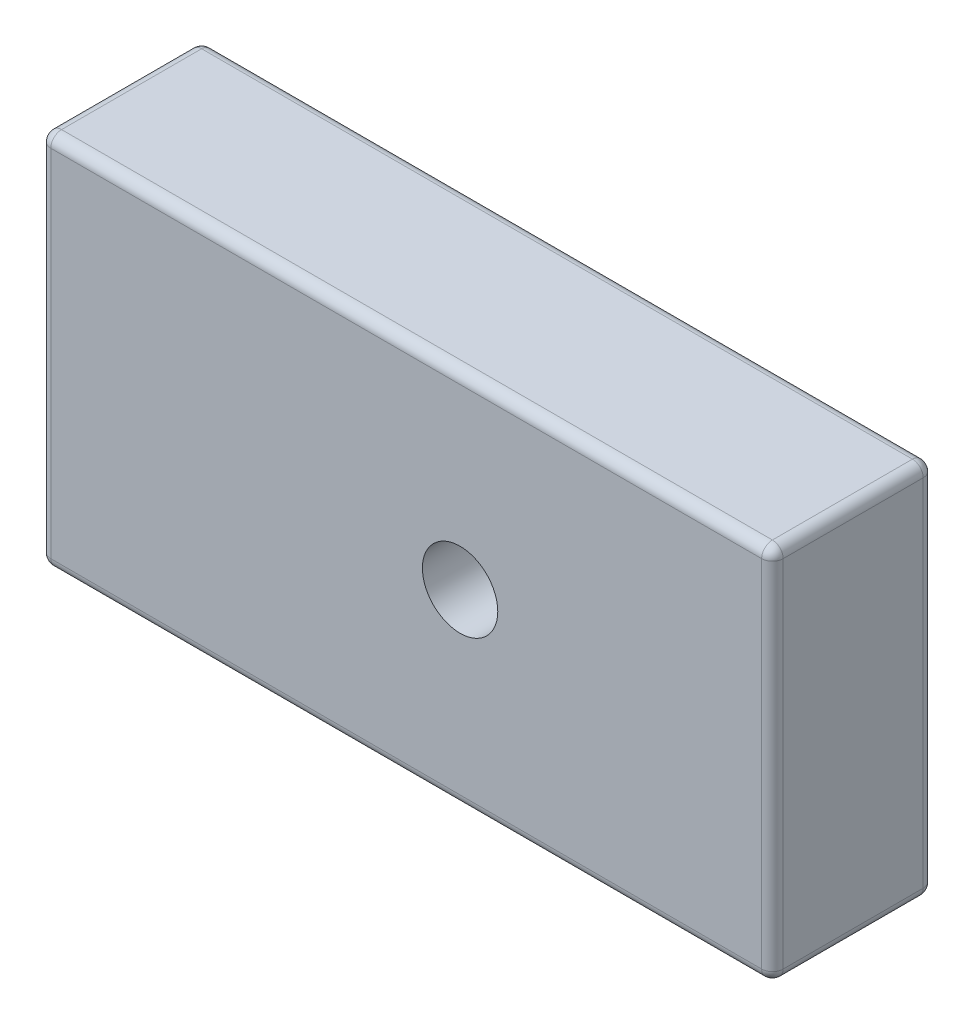
ISO-10303-21;
HEADER;
FILE_DESCRIPTION(('STEP AP214'),'2;1');
FILE_NAME('part.step','',(''),(''),'','','');
FILE_SCHEMA(('AUTOMOTIVE_DESIGN { 1 0 10303 214 1 1 1 1 }'));
ENDSEC;
DATA;
#1=APPLICATION_CONTEXT('core data for automotive mechanical design processes');
#2=APPLICATION_PROTOCOL_DEFINITION('international standard','automotive_design',2000,#1);
#3=PRODUCT_CONTEXT('',#1,'mechanical');
#4=PRODUCT('Part','Part','',(#3));
#5=PRODUCT_RELATED_PRODUCT_CATEGORY('part','',(#4));
#6=PRODUCT_DEFINITION_FORMATION('','',#4);
#7=PRODUCT_DEFINITION_CONTEXT('part definition',#1,'design');
#8=PRODUCT_DEFINITION('design','',#6,#7);
#9=PRODUCT_DEFINITION_SHAPE('','',#8);
#10=(LENGTH_UNIT() NAMED_UNIT(*) SI_UNIT(.MILLI.,.METRE.));
#11=(NAMED_UNIT(*) PLANE_ANGLE_UNIT() SI_UNIT($,.RADIAN.));
#12=(NAMED_UNIT(*) SI_UNIT($,.STERADIAN.) SOLID_ANGLE_UNIT());
#13=UNCERTAINTY_MEASURE_WITH_UNIT(LENGTH_MEASURE(1.E-05),#10,'distance_accuracy_value','');
#14=(GEOMETRIC_REPRESENTATION_CONTEXT(3) GLOBAL_UNCERTAINTY_ASSIGNED_CONTEXT((#13)) GLOBAL_UNIT_ASSIGNED_CONTEXT((#10,
#11,#12)) REPRESENTATION_CONTEXT('',''));
#15=CARTESIAN_POINT('',(0.,0.,0.));
#16=DIRECTION('',(0.,0.,1.));
#17=DIRECTION('',(1.,0.,0.));
#18=AXIS2_PLACEMENT_3D('',#15,#16,#17);
#19=CARTESIAN_POINT('',(34.,-17.5,15.));
#20=DIRECTION('',(-1.,0.,0.));
#21=DIRECTION('',(0.,0.,1.));
#22=AXIS2_PLACEMENT_3D('',#19,#20,#21);
#23=PLANE('',#22);
#24=DIRECTION('',(0.,1.,0.));
#25=VECTOR('',#24,1.);
#26=CARTESIAN_POINT('',(34.,17.5,1.));
#27=LINE('',#26,#25);
#28=CARTESIAN_POINT('',(34.,-16.5,1.));
#29=VERTEX_POINT('',#28);
#30=CARTESIAN_POINT('',(34.,16.5,1.));
#31=VERTEX_POINT('',#30);
#32=EDGE_CURVE('E348',#29,#31,#27,.T.);
#33=ORIENTED_EDGE('',*,*,#32,.T.);
#34=DIRECTION('',(0.,0.,-1.));
#35=VECTOR('',#34,1.);
#36=CARTESIAN_POINT('',(34.,16.5,15.));
#37=LINE('',#36,#35);
#38=CARTESIAN_POINT('',(34.,16.5,14.));
#39=VERTEX_POINT('',#38);
#40=EDGE_CURVE('E199',#31,#39,#37,.F.);
#41=ORIENTED_EDGE('',*,*,#40,.T.);
#42=DIRECTION('',(0.,1.,0.));
#43=VECTOR('',#42,1.);
#44=CARTESIAN_POINT('',(34.,-17.5,14.));
#45=LINE('',#44,#43);
#46=CARTESIAN_POINT('',(34.,-16.5,14.));
#47=VERTEX_POINT('',#46);
#48=EDGE_CURVE('E350',#39,#47,#45,.F.);
#49=ORIENTED_EDGE('',*,*,#48,.T.);
#50=DIRECTION('',(0.,0.,-1.));
#51=VECTOR('',#50,1.);
#52=CARTESIAN_POINT('',(34.,-16.5,15.));
#53=LINE('',#52,#51);
#54=EDGE_CURVE('E329',#47,#29,#53,.T.);
#55=ORIENTED_EDGE('',*,*,#54,.T.);
#56=EDGE_LOOP('',(#33,#41,#49,#55));
#57=FACE_BOUND('',#56,.T.);
#58=ADVANCED_FACE('F39',(#57),#23,.F.);
#59=CARTESIAN_POINT('',(-34.,17.5,15.));
#60=DIRECTION('',(0.,-1.,0.));
#61=DIRECTION('',(0.,0.,-1.));
#62=AXIS2_PLACEMENT_3D('',#59,#60,#61);
#63=PLANE('',#62);
#64=DIRECTION('',(0.,0.,-1.));
#65=VECTOR('',#64,1.);
#66=CARTESIAN_POINT('',(-33.,17.5,15.));
#67=LINE('',#66,#65);
#68=CARTESIAN_POINT('',(-33.,17.5,1.));
#69=VERTEX_POINT('',#68);
#70=CARTESIAN_POINT('',(-33.,17.5,14.));
#71=VERTEX_POINT('',#70);
#72=EDGE_CURVE('E188',#69,#71,#67,.F.);
#73=ORIENTED_EDGE('',*,*,#72,.T.);
#74=DIRECTION('',(-1.,0.,0.));
#75=VECTOR('',#74,1.);
#76=CARTESIAN_POINT('',(-34.,17.5,14.));
#77=LINE('',#76,#75);
#78=CARTESIAN_POINT('',(33.,17.5,14.));
#79=VERTEX_POINT('',#78);
#80=EDGE_CURVE('E194',#71,#79,#77,.F.);
#81=ORIENTED_EDGE('',*,*,#80,.T.);
#82=DIRECTION('',(0.,0.,-1.));
#83=VECTOR('',#82,1.);
#84=CARTESIAN_POINT('',(33.,17.5,15.));
#85=LINE('',#84,#83);
#86=CARTESIAN_POINT('',(33.,17.5,1.));
#87=VERTEX_POINT('',#86);
#88=EDGE_CURVE('E192',#79,#87,#85,.T.);
#89=ORIENTED_EDGE('',*,*,#88,.T.);
#90=DIRECTION('',(-1.,0.,0.));
#91=VECTOR('',#90,1.);
#92=CARTESIAN_POINT('',(-33.,17.5,1.));
#93=LINE('',#92,#91);
#94=EDGE_CURVE('E190',#87,#69,#93,.T.);
#95=ORIENTED_EDGE('',*,*,#94,.T.);
#96=EDGE_LOOP('',(#73,#81,#89,#95));
#97=FACE_BOUND('',#96,.T.);
#98=ADVANCED_FACE('F239',(#97),#63,.F.);
#99=CARTESIAN_POINT('',(-34.,-17.5,15.));
#100=DIRECTION('',(1.,0.,0.));
#101=DIRECTION('',(0.,0.,-1.));
#102=AXIS2_PLACEMENT_3D('',#99,#100,#101);
#103=PLANE('',#102);
#104=DIRECTION('',(0.,-1.,0.));
#105=VECTOR('',#104,1.);
#106=CARTESIAN_POINT('',(-34.,-17.5,14.));
#107=LINE('',#106,#105);
#108=CARTESIAN_POINT('',(-34.,-16.5,14.));
#109=VERTEX_POINT('',#108);
#110=CARTESIAN_POINT('',(-34.,16.5,14.));
#111=VERTEX_POINT('',#110);
#112=EDGE_CURVE('E130',#109,#111,#107,.F.);
#113=ORIENTED_EDGE('',*,*,#112,.T.);
#114=DIRECTION('',(0.,0.,-1.));
#115=VECTOR('',#114,1.);
#116=CARTESIAN_POINT('',(-34.,16.5,15.));
#117=LINE('',#116,#115);
#118=CARTESIAN_POINT('',(-34.,16.5,1.));
#119=VERTEX_POINT('',#118);
#120=EDGE_CURVE('E11',#111,#119,#117,.T.);
#121=ORIENTED_EDGE('',*,*,#120,.T.);
#122=DIRECTION('',(0.,-1.,0.));
#123=VECTOR('',#122,1.);
#124=CARTESIAN_POINT('',(-34.,-17.5,1.));
#125=LINE('',#124,#123);
#126=CARTESIAN_POINT('',(-34.,-16.5,1.));
#127=VERTEX_POINT('',#126);
#128=EDGE_CURVE('E131',#119,#127,#125,.T.);
#129=ORIENTED_EDGE('',*,*,#128,.T.);
#130=DIRECTION('',(0.,0.,-1.));
#131=VECTOR('',#130,1.);
#132=CARTESIAN_POINT('',(-34.,-16.5,15.));
#133=LINE('',#132,#131);
#134=EDGE_CURVE('E127',#127,#109,#133,.F.);
#135=ORIENTED_EDGE('',*,*,#134,.T.);
#136=EDGE_LOOP('',(#113,#121,#129,#135));
#137=FACE_BOUND('',#136,.T.);
#138=ADVANCED_FACE('F129',(#137),#103,.F.);
#139=CARTESIAN_POINT('',(-34.,-17.5,15.));
#140=DIRECTION('',(0.,1.,0.));
#141=DIRECTION('',(0.,0.,1.));
#142=AXIS2_PLACEMENT_3D('',#139,#140,#141);
#143=PLANE('',#142);
#144=DIRECTION('',(0.,0.,-1.));
#145=VECTOR('',#144,1.);
#146=CARTESIAN_POINT('',(33.,-17.5,15.));
#147=LINE('',#146,#145);
#148=CARTESIAN_POINT('',(33.,-17.5,1.));
#149=VERTEX_POINT('',#148);
#150=CARTESIAN_POINT('',(33.,-17.5,14.));
#151=VERTEX_POINT('',#150);
#152=EDGE_CURVE('E338',#149,#151,#147,.F.);
#153=ORIENTED_EDGE('',*,*,#152,.T.);
#154=DIRECTION('',(1.,0.,0.));
#155=VECTOR('',#154,1.);
#156=CARTESIAN_POINT('',(-34.,-17.5,14.));
#157=LINE('',#156,#155);
#158=CARTESIAN_POINT('',(-33.,-17.5,14.));
#159=VERTEX_POINT('',#158);
#160=EDGE_CURVE('E336',#151,#159,#157,.F.);
#161=ORIENTED_EDGE('',*,*,#160,.T.);
#162=DIRECTION('',(0.,0.,-1.));
#163=VECTOR('',#162,1.);
#164=CARTESIAN_POINT('',(-33.,-17.5,15.));
#165=LINE('',#164,#163);
#166=CARTESIAN_POINT('',(-33.,-17.5,1.));
#167=VERTEX_POINT('',#166);
#168=EDGE_CURVE('E161',#159,#167,#165,.T.);
#169=ORIENTED_EDGE('',*,*,#168,.T.);
#170=DIRECTION('',(1.,0.,0.));
#171=VECTOR('',#170,1.);
#172=CARTESIAN_POINT('',(33.,-17.5,1.));
#173=LINE('',#172,#171);
#174=EDGE_CURVE('E340',#167,#149,#173,.T.);
#175=ORIENTED_EDGE('',*,*,#174,.T.);
#176=EDGE_LOOP('',(#153,#161,#169,#175));
#177=FACE_BOUND('',#176,.T.);
#178=ADVANCED_FACE('F369',(#177),#143,.F.);
#179=CARTESIAN_POINT('',(0.,0.,15.));
#180=DIRECTION('',(0.,0.,-1.));
#181=DIRECTION('',(-1.,0.,0.));
#182=AXIS2_PLACEMENT_3D('',#179,#180,#181);
#183=PLANE('',#182);
#184=CARTESIAN_POINT('',(4.99999999999998,0.,15.));
#185=DIRECTION('',(0.,0.,1.));
#186=DIRECTION('',(1.,0.,0.));
#187=AXIS2_PLACEMENT_3D('',#184,#185,#186);
#188=CIRCLE('',#187,3.5);
#189=CARTESIAN_POINT('',(8.49999999999998,0.,15.));
#190=VERTEX_POINT('',#189);
#191=EDGE_CURVE('E357',#190,#190,#188,.T.);
#192=ORIENTED_EDGE('',*,*,#191,.F.);
#193=EDGE_LOOP('',(#192));
#194=FACE_BOUND('',#193,.T.);
#195=DIRECTION('',(0.,1.,0.));
#196=VECTOR('',#195,1.);
#197=CARTESIAN_POINT('',(33.,0.,15.));
#198=LINE('',#197,#196);
#199=CARTESIAN_POINT('',(33.,-16.5,15.));
#200=VERTEX_POINT('',#199);
#201=CARTESIAN_POINT('',(33.,16.5,15.));
#202=VERTEX_POINT('',#201);
#203=EDGE_CURVE('E157',#200,#202,#198,.T.);
#204=ORIENTED_EDGE('',*,*,#203,.T.);
#205=DIRECTION('',(-1.,0.,0.));
#206=VECTOR('',#205,1.);
#207=CARTESIAN_POINT('',(0.,16.5,15.));
#208=LINE('',#207,#206);
#209=CARTESIAN_POINT('',(-33.,16.5,15.));
#210=VERTEX_POINT('',#209);
#211=EDGE_CURVE('E186',#202,#210,#208,.T.);
#212=ORIENTED_EDGE('',*,*,#211,.T.);
#213=DIRECTION('',(0.,-1.,0.));
#214=VECTOR('',#213,1.);
#215=CARTESIAN_POINT('',(-33.,0.,15.));
#216=LINE('',#215,#214);
#217=CARTESIAN_POINT('',(-33.,-16.5,15.));
#218=VERTEX_POINT('',#217);
#219=EDGE_CURVE('E352',#210,#218,#216,.T.);
#220=ORIENTED_EDGE('',*,*,#219,.T.);
#221=DIRECTION('',(1.,0.,0.));
#222=VECTOR('',#221,1.);
#223=CARTESIAN_POINT('',(0.,-16.5,15.));
#224=LINE('',#223,#222);
#225=EDGE_CURVE('E156',#218,#200,#224,.T.);
#226=ORIENTED_EDGE('',*,*,#225,.T.);
#227=EDGE_LOOP('',(#204,#212,#220,#226));
#228=FACE_BOUND('',#227,.T.);
#229=ADVANCED_FACE('F366',(#194,#228),#183,.F.);
#230=CARTESIAN_POINT('',(0.,0.,0.));
#231=DIRECTION('',(0.,0.,-1.));
#232=DIRECTION('',(-1.,0.,0.));
#233=AXIS2_PLACEMENT_3D('',#230,#231,#232);
#234=PLANE('',#233);
#235=DIRECTION('',(0.,-1.,0.));
#236=VECTOR('',#235,1.);
#237=CARTESIAN_POINT('',(-33.,17.5,0.));
#238=LINE('',#237,#236);
#239=CARTESIAN_POINT('',(-33.,-16.5,0.));
#240=VERTEX_POINT('',#239);
#241=CARTESIAN_POINT('',(-33.,16.5,0.));
#242=VERTEX_POINT('',#241);
#243=EDGE_CURVE('E354',#240,#242,#238,.F.);
#244=ORIENTED_EDGE('',*,*,#243,.T.);
#245=DIRECTION('',(-1.,0.,0.));
#246=VECTOR('',#245,1.);
#247=CARTESIAN_POINT('',(33.,16.5,0.));
#248=LINE('',#247,#246);
#249=CARTESIAN_POINT('',(33.,16.5,0.));
#250=VERTEX_POINT('',#249);
#251=EDGE_CURVE('E203',#242,#250,#248,.F.);
#252=ORIENTED_EDGE('',*,*,#251,.T.);
#253=DIRECTION('',(0.,1.,0.));
#254=VECTOR('',#253,1.);
#255=CARTESIAN_POINT('',(33.,-17.5,0.));
#256=LINE('',#255,#254);
#257=CARTESIAN_POINT('',(33.,-16.5,0.));
#258=VERTEX_POINT('',#257);
#259=EDGE_CURVE('E346',#250,#258,#256,.F.);
#260=ORIENTED_EDGE('',*,*,#259,.T.);
#261=DIRECTION('',(1.,0.,0.));
#262=VECTOR('',#261,1.);
#263=CARTESIAN_POINT('',(-33.,-16.5,0.));
#264=LINE('',#263,#262);
#265=EDGE_CURVE('E325',#258,#240,#264,.F.);
#266=ORIENTED_EDGE('',*,*,#265,.T.);
#267=EDGE_LOOP('',(#244,#252,#260,#266));
#268=FACE_BOUND('',#267,.T.);
#269=ADVANCED_FACE('F277',(#268),#234,.T.);
#270=CARTESIAN_POINT('',(-33.,-17.5,1.));
#271=DIRECTION('',(0.,1.,0.));
#272=DIRECTION('',(0.,0.,1.));
#273=AXIS2_PLACEMENT_3D('',#270,#271,#272);
#274=CYLINDRICAL_SURFACE('',#273,1.);
#275=ORIENTED_EDGE('',*,*,#128,.F.);
#276=CARTESIAN_POINT('',(-33.,16.5,1.));
#277=DIRECTION('',(0.,1.,0.));
#278=DIRECTION('',(0.,0.,1.));
#279=AXIS2_PLACEMENT_3D('',#276,#277,#278);
#280=CIRCLE('',#279,1.);
#281=EDGE_CURVE('E48',#119,#242,#280,.F.);
#282=ORIENTED_EDGE('',*,*,#281,.T.);
#283=ORIENTED_EDGE('',*,*,#243,.F.);
#284=CARTESIAN_POINT('',(-33.,-16.5,1.));
#285=DIRECTION('',(0.,1.,0.));
#286=DIRECTION('',(0.,0.,1.));
#287=AXIS2_PLACEMENT_3D('',#284,#285,#286);
#288=CIRCLE('',#287,1.);
#289=EDGE_CURVE('E137',#240,#127,#288,.T.);
#290=ORIENTED_EDGE('',*,*,#289,.T.);
#291=EDGE_LOOP('',(#275,#282,#283,#290));
#292=FACE_BOUND('',#291,.T.);
#293=ADVANCED_FACE('F274',(#292),#274,.T.);
#294=CARTESIAN_POINT('',(-33.,0.,14.));
#295=DIRECTION('',(0.,-1.,0.));
#296=DIRECTION('',(0.,0.,-1.));
#297=AXIS2_PLACEMENT_3D('',#294,#295,#296);
#298=CYLINDRICAL_SURFACE('',#297,1.);
#299=ORIENTED_EDGE('',*,*,#219,.F.);
#300=CARTESIAN_POINT('',(-33.,16.5,14.));
#301=DIRECTION('',(0.,-1.,0.));
#302=DIRECTION('',(0.,0.,-1.));
#303=AXIS2_PLACEMENT_3D('',#300,#301,#302);
#304=CIRCLE('',#303,1.);
#305=EDGE_CURVE('E136',#210,#111,#304,.T.);
#306=ORIENTED_EDGE('',*,*,#305,.T.);
#307=ORIENTED_EDGE('',*,*,#112,.F.);
#308=CARTESIAN_POINT('',(-33.,-16.5,14.));
#309=DIRECTION('',(0.,-1.,0.));
#310=DIRECTION('',(0.,0.,-1.));
#311=AXIS2_PLACEMENT_3D('',#308,#309,#310);
#312=CIRCLE('',#311,1.);
#313=EDGE_CURVE('E145',#109,#218,#312,.F.);
#314=ORIENTED_EDGE('',*,*,#313,.T.);
#315=EDGE_LOOP('',(#299,#306,#307,#314));
#316=FACE_BOUND('',#315,.T.);
#317=ADVANCED_FACE('F144',(#316),#298,.T.);
#318=CARTESIAN_POINT('',(33.,-17.5,1.));
#319=DIRECTION('',(0.,-1.,0.));
#320=DIRECTION('',(0.,0.,-1.));
#321=AXIS2_PLACEMENT_3D('',#318,#319,#320);
#322=CYLINDRICAL_SURFACE('',#321,1.);
#323=ORIENTED_EDGE('',*,*,#259,.F.);
#324=CARTESIAN_POINT('',(33.,16.5,1.));
#325=DIRECTION('',(0.,-1.,0.));
#326=DIRECTION('',(0.,0.,-1.));
#327=AXIS2_PLACEMENT_3D('',#324,#325,#326);
#328=CIRCLE('',#327,1.);
#329=EDGE_CURVE('E201',#250,#31,#328,.T.);
#330=ORIENTED_EDGE('',*,*,#329,.T.);
#331=ORIENTED_EDGE('',*,*,#32,.F.);
#332=CARTESIAN_POINT('',(33.,-16.5,1.));
#333=DIRECTION('',(0.,-1.,0.));
#334=DIRECTION('',(0.,0.,-1.));
#335=AXIS2_PLACEMENT_3D('',#332,#333,#334);
#336=CIRCLE('',#335,1.);
#337=EDGE_CURVE('E321',#29,#258,#336,.F.);
#338=ORIENTED_EDGE('',*,*,#337,.T.);
#339=EDGE_LOOP('',(#323,#330,#331,#338));
#340=FACE_BOUND('',#339,.T.);
#341=ADVANCED_FACE('F280',(#340),#322,.T.);
#342=CARTESIAN_POINT('',(33.,0.,14.));
#343=DIRECTION('',(0.,1.,0.));
#344=DIRECTION('',(0.,0.,1.));
#345=AXIS2_PLACEMENT_3D('',#342,#343,#344);
#346=CYLINDRICAL_SURFACE('',#345,1.);
#347=ORIENTED_EDGE('',*,*,#48,.F.);
#348=CARTESIAN_POINT('',(33.,16.5,14.));
#349=DIRECTION('',(0.,1.,0.));
#350=DIRECTION('',(0.,0.,1.));
#351=AXIS2_PLACEMENT_3D('',#348,#349,#350);
#352=CIRCLE('',#351,1.);
#353=EDGE_CURVE('E197',#39,#202,#352,.F.);
#354=ORIENTED_EDGE('',*,*,#353,.T.);
#355=ORIENTED_EDGE('',*,*,#203,.F.);
#356=CARTESIAN_POINT('',(33.,-16.5,14.));
#357=DIRECTION('',(0.,1.,0.));
#358=DIRECTION('',(0.,0.,1.));
#359=AXIS2_PLACEMENT_3D('',#356,#357,#358);
#360=CIRCLE('',#359,1.);
#361=EDGE_CURVE('E333',#200,#47,#360,.T.);
#362=ORIENTED_EDGE('',*,*,#361,.T.);
#363=EDGE_LOOP('',(#347,#354,#355,#362));
#364=FACE_BOUND('',#363,.T.);
#365=ADVANCED_FACE('F283',(#364),#346,.T.);
#366=CARTESIAN_POINT('',(33.,-16.5,1.));
#367=DIRECTION('',(0.,0.,1.));
#368=DIRECTION('',(1.,0.,0.));
#369=AXIS2_PLACEMENT_3D('',#366,#367,#368);
#370=SPHERICAL_SURFACE('',#369,1.);
#371=CARTESIAN_POINT('',(33.,-16.5,1.));
#372=DIRECTION('',(-1.,0.,0.));
#373=DIRECTION('',(0.,0.,1.));
#374=AXIS2_PLACEMENT_3D('',#371,#372,#373);
#375=CIRCLE('',#374,1.);
#376=EDGE_CURVE('E180',#258,#149,#375,.T.);
#377=ORIENTED_EDGE('',*,*,#376,.F.);
#378=ORIENTED_EDGE('',*,*,#337,.F.);
#379=CARTESIAN_POINT('',(33.,-16.5,1.));
#380=DIRECTION('',(0.,0.,1.));
#381=DIRECTION('',(1.,0.,0.));
#382=AXIS2_PLACEMENT_3D('',#379,#380,#381);
#383=CIRCLE('',#382,1.);
#384=EDGE_CURVE('E147',#149,#29,#383,.T.);
#385=ORIENTED_EDGE('',*,*,#384,.F.);
#386=EDGE_LOOP('',(#377,#378,#385));
#387=FACE_BOUND('',#386,.T.);
#388=ADVANCED_FACE('F287',(#387),#370,.T.);
#389=CARTESIAN_POINT('',(33.,-16.5,15.));
#390=DIRECTION('',(0.,0.,-1.));
#391=DIRECTION('',(-1.,0.,0.));
#392=AXIS2_PLACEMENT_3D('',#389,#390,#391);
#393=CYLINDRICAL_SURFACE('',#392,1.);
#394=ORIENTED_EDGE('',*,*,#384,.T.);
#395=ORIENTED_EDGE('',*,*,#54,.F.);
#396=CARTESIAN_POINT('',(33.,-16.5,14.));
#397=DIRECTION('',(0.,0.,1.));
#398=DIRECTION('',(1.,0.,0.));
#399=AXIS2_PLACEMENT_3D('',#396,#397,#398);
#400=CIRCLE('',#399,1.);
#401=EDGE_CURVE('E177',#151,#47,#400,.T.);
#402=ORIENTED_EDGE('',*,*,#401,.F.);
#403=ORIENTED_EDGE('',*,*,#152,.F.);
#404=EDGE_LOOP('',(#394,#395,#402,#403));
#405=FACE_BOUND('',#404,.T.);
#406=ADVANCED_FACE('F308',(#405),#393,.T.);
#407=CARTESIAN_POINT('',(-34.,-16.5,1.));
#408=DIRECTION('',(-1.,0.,0.));
#409=DIRECTION('',(0.,0.,1.));
#410=AXIS2_PLACEMENT_3D('',#407,#408,#409);
#411=CYLINDRICAL_SURFACE('',#410,1.);
#412=ORIENTED_EDGE('',*,*,#376,.T.);
#413=ORIENTED_EDGE('',*,*,#174,.F.);
#414=CARTESIAN_POINT('',(-33.,-16.5,1.));
#415=DIRECTION('',(-1.,0.,0.));
#416=DIRECTION('',(0.,0.,1.));
#417=AXIS2_PLACEMENT_3D('',#414,#415,#416);
#418=CIRCLE('',#417,1.);
#419=EDGE_CURVE('E174',#240,#167,#418,.T.);
#420=ORIENTED_EDGE('',*,*,#419,.F.);
#421=ORIENTED_EDGE('',*,*,#265,.F.);
#422=EDGE_LOOP('',(#412,#413,#420,#421));
#423=FACE_BOUND('',#422,.T.);
#424=ADVANCED_FACE('F304',(#423),#411,.T.);
#425=CARTESIAN_POINT('',(33.,-16.5,14.));
#426=DIRECTION('',(0.,0.,1.));
#427=DIRECTION('',(1.,0.,0.));
#428=AXIS2_PLACEMENT_3D('',#425,#426,#427);
#429=SPHERICAL_SURFACE('',#428,1.);
#430=ORIENTED_EDGE('',*,*,#401,.T.);
#431=ORIENTED_EDGE('',*,*,#361,.F.);
#432=CARTESIAN_POINT('',(33.,-16.5,14.));
#433=DIRECTION('',(-1.,0.,0.));
#434=DIRECTION('',(0.,0.,1.));
#435=AXIS2_PLACEMENT_3D('',#432,#433,#434);
#436=CIRCLE('',#435,1.);
#437=EDGE_CURVE('E171',#151,#200,#436,.T.);
#438=ORIENTED_EDGE('',*,*,#437,.F.);
#439=EDGE_LOOP('',(#430,#431,#438));
#440=FACE_BOUND('',#439,.T.);
#441=ADVANCED_FACE('F300',(#440),#429,.T.);
#442=CARTESIAN_POINT('',(-33.,-16.5,1.));
#443=DIRECTION('',(0.,0.,1.));
#444=DIRECTION('',(1.,0.,0.));
#445=AXIS2_PLACEMENT_3D('',#442,#443,#444);
#446=SPHERICAL_SURFACE('',#445,1.);
#447=ORIENTED_EDGE('',*,*,#289,.F.);
#448=ORIENTED_EDGE('',*,*,#419,.T.);
#449=CARTESIAN_POINT('',(-33.,-16.5,1.));
#450=DIRECTION('',(0.,0.,1.));
#451=DIRECTION('',(1.,0.,0.));
#452=AXIS2_PLACEMENT_3D('',#449,#450,#451);
#453=CIRCLE('',#452,1.);
#454=EDGE_CURVE('E164',#127,#167,#453,.T.);
#455=ORIENTED_EDGE('',*,*,#454,.F.);
#456=EDGE_LOOP('',(#447,#448,#455));
#457=FACE_BOUND('',#456,.T.);
#458=ADVANCED_FACE('F296',(#457),#446,.T.);
#459=CARTESIAN_POINT('',(0.,-16.5,14.));
#460=DIRECTION('',(1.,0.,0.));
#461=DIRECTION('',(0.,0.,-1.));
#462=AXIS2_PLACEMENT_3D('',#459,#460,#461);
#463=CYLINDRICAL_SURFACE('',#462,1.);
#464=ORIENTED_EDGE('',*,*,#437,.T.);
#465=ORIENTED_EDGE('',*,*,#225,.F.);
#466=CARTESIAN_POINT('',(-33.,-16.5,14.));
#467=DIRECTION('',(-1.,0.,0.));
#468=DIRECTION('',(0.,0.,1.));
#469=AXIS2_PLACEMENT_3D('',#466,#467,#468);
#470=CIRCLE('',#469,1.);
#471=EDGE_CURVE('E154',#159,#218,#470,.T.);
#472=ORIENTED_EDGE('',*,*,#471,.F.);
#473=ORIENTED_EDGE('',*,*,#160,.F.);
#474=EDGE_LOOP('',(#464,#465,#472,#473));
#475=FACE_BOUND('',#474,.T.);
#476=ADVANCED_FACE('F293',(#475),#463,.T.);
#477=CARTESIAN_POINT('',(-33.,-16.5,15.));
#478=DIRECTION('',(0.,0.,-1.));
#479=DIRECTION('',(-1.,0.,0.));
#480=AXIS2_PLACEMENT_3D('',#477,#478,#479);
#481=CYLINDRICAL_SURFACE('',#480,1.);
#482=ORIENTED_EDGE('',*,*,#454,.T.);
#483=ORIENTED_EDGE('',*,*,#168,.F.);
#484=CARTESIAN_POINT('',(-33.,-16.5,14.));
#485=DIRECTION('',(0.,0.,1.));
#486=DIRECTION('',(1.,0.,0.));
#487=AXIS2_PLACEMENT_3D('',#484,#485,#486);
#488=CIRCLE('',#487,1.);
#489=EDGE_CURVE('E152',#109,#159,#488,.T.);
#490=ORIENTED_EDGE('',*,*,#489,.F.);
#491=ORIENTED_EDGE('',*,*,#134,.F.);
#492=EDGE_LOOP('',(#482,#483,#490,#491));
#493=FACE_BOUND('',#492,.T.);
#494=ADVANCED_FACE('F160',(#493),#481,.T.);
#495=CARTESIAN_POINT('',(-33.,-16.5,14.));
#496=DIRECTION('',(0.,0.,1.));
#497=DIRECTION('',(1.,0.,0.));
#498=AXIS2_PLACEMENT_3D('',#495,#496,#497);
#499=SPHERICAL_SURFACE('',#498,1.);
#500=ORIENTED_EDGE('',*,*,#471,.T.);
#501=ORIENTED_EDGE('',*,*,#313,.F.);
#502=ORIENTED_EDGE('',*,*,#489,.T.);
#503=EDGE_LOOP('',(#500,#501,#502));
#504=FACE_BOUND('',#503,.T.);
#505=ADVANCED_FACE('F151',(#504),#499,.T.);
#506=CARTESIAN_POINT('',(33.,16.5,1.));
#507=DIRECTION('',(0.,0.,1.));
#508=DIRECTION('',(1.,0.,0.));
#509=AXIS2_PLACEMENT_3D('',#506,#507,#508);
#510=SPHERICAL_SURFACE('',#509,1.);
#511=CARTESIAN_POINT('',(33.,16.5,1.));
#512=DIRECTION('',(0.,0.,1.));
#513=DIRECTION('',(1.,0.,0.));
#514=AXIS2_PLACEMENT_3D('',#511,#512,#513);
#515=CIRCLE('',#514,1.);
#516=EDGE_CURVE('E167',#31,#87,#515,.T.);
#517=ORIENTED_EDGE('',*,*,#516,.F.);
#518=ORIENTED_EDGE('',*,*,#329,.F.);
#519=CARTESIAN_POINT('',(33.,16.5,1.));
#520=DIRECTION('',(-1.,0.,0.));
#521=DIRECTION('',(0.,0.,1.));
#522=AXIS2_PLACEMENT_3D('',#519,#520,#521);
#523=CIRCLE('',#522,1.);
#524=EDGE_CURVE('E43',#87,#250,#523,.T.);
#525=ORIENTED_EDGE('',*,*,#524,.F.);
#526=EDGE_LOOP('',(#517,#518,#525));
#527=FACE_BOUND('',#526,.T.);
#528=ADVANCED_FACE('F41',(#527),#510,.T.);
#529=CARTESIAN_POINT('',(-34.,16.5,1.));
#530=DIRECTION('',(1.,0.,0.));
#531=DIRECTION('',(0.,0.,-1.));
#532=AXIS2_PLACEMENT_3D('',#529,#530,#531);
#533=CYLINDRICAL_SURFACE('',#532,1.);
#534=ORIENTED_EDGE('',*,*,#524,.T.);
#535=ORIENTED_EDGE('',*,*,#251,.F.);
#536=CARTESIAN_POINT('',(-33.,16.5,1.));
#537=DIRECTION('',(-1.,0.,0.));
#538=DIRECTION('',(0.,0.,1.));
#539=AXIS2_PLACEMENT_3D('',#536,#537,#538);
#540=CIRCLE('',#539,1.);
#541=EDGE_CURVE('E220',#69,#242,#540,.T.);
#542=ORIENTED_EDGE('',*,*,#541,.F.);
#543=ORIENTED_EDGE('',*,*,#94,.F.);
#544=EDGE_LOOP('',(#534,#535,#542,#543));
#545=FACE_BOUND('',#544,.T.);
#546=ADVANCED_FACE('F236',(#545),#533,.T.);
#547=CARTESIAN_POINT('',(33.,16.5,15.));
#548=DIRECTION('',(0.,0.,-1.));
#549=DIRECTION('',(-1.,0.,0.));
#550=AXIS2_PLACEMENT_3D('',#547,#548,#549);
#551=CYLINDRICAL_SURFACE('',#550,1.);
#552=ORIENTED_EDGE('',*,*,#516,.T.);
#553=ORIENTED_EDGE('',*,*,#88,.F.);
#554=CARTESIAN_POINT('',(33.,16.5,14.));
#555=DIRECTION('',(0.,0.,1.));
#556=DIRECTION('',(1.,0.,0.));
#557=AXIS2_PLACEMENT_3D('',#554,#555,#556);
#558=CIRCLE('',#557,1.);
#559=EDGE_CURVE('E217',#39,#79,#558,.T.);
#560=ORIENTED_EDGE('',*,*,#559,.F.);
#561=ORIENTED_EDGE('',*,*,#40,.F.);
#562=EDGE_LOOP('',(#552,#553,#560,#561));
#563=FACE_BOUND('',#562,.T.);
#564=ADVANCED_FACE('F228',(#563),#551,.T.);
#565=CARTESIAN_POINT('',(-33.,16.5,1.));
#566=DIRECTION('',(0.,0.,1.));
#567=DIRECTION('',(1.,0.,0.));
#568=AXIS2_PLACEMENT_3D('',#565,#566,#567);
#569=SPHERICAL_SURFACE('',#568,1.);
#570=ORIENTED_EDGE('',*,*,#541,.T.);
#571=ORIENTED_EDGE('',*,*,#281,.F.);
#572=CARTESIAN_POINT('',(-33.,16.5,1.));
#573=DIRECTION('',(0.,0.,1.));
#574=DIRECTION('',(1.,0.,0.));
#575=AXIS2_PLACEMENT_3D('',#572,#573,#574);
#576=CIRCLE('',#575,1.);
#577=EDGE_CURVE('E214',#69,#119,#576,.T.);
#578=ORIENTED_EDGE('',*,*,#577,.F.);
#579=EDGE_LOOP('',(#570,#571,#578));
#580=FACE_BOUND('',#579,.T.);
#581=ADVANCED_FACE('F381',(#580),#569,.T.);
#582=CARTESIAN_POINT('',(33.,16.5,14.));
#583=DIRECTION('',(0.,0.,1.));
#584=DIRECTION('',(1.,0.,0.));
#585=AXIS2_PLACEMENT_3D('',#582,#583,#584);
#586=SPHERICAL_SURFACE('',#585,1.);
#587=ORIENTED_EDGE('',*,*,#353,.F.);
#588=ORIENTED_EDGE('',*,*,#559,.T.);
#589=CARTESIAN_POINT('',(33.,16.5,14.));
#590=DIRECTION('',(-1.,0.,0.));
#591=DIRECTION('',(0.,0.,1.));
#592=AXIS2_PLACEMENT_3D('',#589,#590,#591);
#593=CIRCLE('',#592,1.);
#594=EDGE_CURVE('E212',#202,#79,#593,.T.);
#595=ORIENTED_EDGE('',*,*,#594,.F.);
#596=EDGE_LOOP('',(#587,#588,#595));
#597=FACE_BOUND('',#596,.T.);
#598=ADVANCED_FACE('F375',(#597),#586,.T.);
#599=CARTESIAN_POINT('',(-33.,16.5,15.));
#600=DIRECTION('',(0.,0.,-1.));
#601=DIRECTION('',(-1.,0.,0.));
#602=AXIS2_PLACEMENT_3D('',#599,#600,#601);
#603=CYLINDRICAL_SURFACE('',#602,1.);
#604=ORIENTED_EDGE('',*,*,#577,.T.);
#605=ORIENTED_EDGE('',*,*,#120,.F.);
#606=CARTESIAN_POINT('',(-33.,16.5,14.));
#607=DIRECTION('',(0.,0.,1.));
#608=DIRECTION('',(1.,0.,0.));
#609=AXIS2_PLACEMENT_3D('',#606,#607,#608);
#610=CIRCLE('',#609,1.);
#611=EDGE_CURVE('E209',#71,#111,#610,.T.);
#612=ORIENTED_EDGE('',*,*,#611,.F.);
#613=ORIENTED_EDGE('',*,*,#72,.F.);
#614=EDGE_LOOP('',(#604,#605,#612,#613));
#615=FACE_BOUND('',#614,.T.);
#616=ADVANCED_FACE('F249',(#615),#603,.T.);
#617=CARTESIAN_POINT('',(0.,16.5,14.));
#618=DIRECTION('',(-1.,0.,0.));
#619=DIRECTION('',(0.,0.,1.));
#620=AXIS2_PLACEMENT_3D('',#617,#618,#619);
#621=CYLINDRICAL_SURFACE('',#620,1.);
#622=ORIENTED_EDGE('',*,*,#594,.T.);
#623=ORIENTED_EDGE('',*,*,#80,.F.);
#624=CARTESIAN_POINT('',(-33.,16.5,14.));
#625=DIRECTION('',(-1.,0.,0.));
#626=DIRECTION('',(0.,0.,1.));
#627=AXIS2_PLACEMENT_3D('',#624,#625,#626);
#628=CIRCLE('',#627,1.);
#629=EDGE_CURVE('E206',#210,#71,#628,.T.);
#630=ORIENTED_EDGE('',*,*,#629,.F.);
#631=ORIENTED_EDGE('',*,*,#211,.F.);
#632=EDGE_LOOP('',(#622,#623,#630,#631));
#633=FACE_BOUND('',#632,.T.);
#634=ADVANCED_FACE('F245',(#633),#621,.T.);
#635=CARTESIAN_POINT('',(-33.,16.5,14.));
#636=DIRECTION('',(0.,0.,1.));
#637=DIRECTION('',(1.,0.,0.));
#638=AXIS2_PLACEMENT_3D('',#635,#636,#637);
#639=SPHERICAL_SURFACE('',#638,1.);
#640=ORIENTED_EDGE('',*,*,#611,.T.);
#641=ORIENTED_EDGE('',*,*,#305,.F.);
#642=ORIENTED_EDGE('',*,*,#629,.T.);
#643=EDGE_LOOP('',(#640,#641,#642));
#644=FACE_BOUND('',#643,.T.);
#645=ADVANCED_FACE('F251',(#644),#639,.T.);
#646=CARTESIAN_POINT('',(4.99999999999998,0.,10.));
#647=DIRECTION('',(0.,0.,1.));
#648=DIRECTION('',(1.,0.,0.));
#649=AXIS2_PLACEMENT_3D('',#646,#647,#648);
#650=CYLINDRICAL_SURFACE('',#649,3.5);
#651=CARTESIAN_POINT('',(4.99999999999998,0.,10.));
#652=DIRECTION('',(0.,0.,1.));
#653=DIRECTION('',(1.,0.,0.));
#654=AXIS2_PLACEMENT_3D('',#651,#652,#653);
#655=CIRCLE('',#654,3.5);
#656=CARTESIAN_POINT('',(8.49999999999998,0.,10.));
#657=VERTEX_POINT('',#656);
#658=EDGE_CURVE('E210',#657,#657,#655,.T.);
#659=ORIENTED_EDGE('',*,*,#658,.F.);
#660=EDGE_LOOP('',(#659));
#661=FACE_BOUND('',#660,.T.);
#662=ORIENTED_EDGE('',*,*,#191,.T.);
#663=EDGE_LOOP('',(#662));
#664=FACE_BOUND('',#663,.T.);
#665=ADVANCED_FACE('F253',(#661,#664),#650,.F.);
#666=CARTESIAN_POINT('',(4.99999999999998,0.,10.));
#667=DIRECTION('',(0.,0.,1.));
#668=DIRECTION('',(1.,0.,0.));
#669=AXIS2_PLACEMENT_3D('',#666,#667,#668);
#670=PLANE('',#669);
#671=ORIENTED_EDGE('',*,*,#658,.T.);
#672=EDGE_LOOP('',(#671));
#673=FACE_BOUND('',#672,.T.);
#674=ADVANCED_FACE('F259',(#673),#670,.T.);
#675=CLOSED_SHELL('',(#58,#98,#138,#178,#229,#269,#293,#317,#341,#365,#388,#406,#424,#441,#458,
#476,#494,#505,#528,#546,#564,#581,#598,#616,#634,#645,#665,#674));
#676=MANIFOLD_SOLID_BREP('B2',#675);
#677=ADVANCED_BREP_SHAPE_REPRESENTATION('',(#18,#676),#14);
#678=SHAPE_DEFINITION_REPRESENTATION(#9,#677);
ENDSEC;
END-ISO-10303-21;
